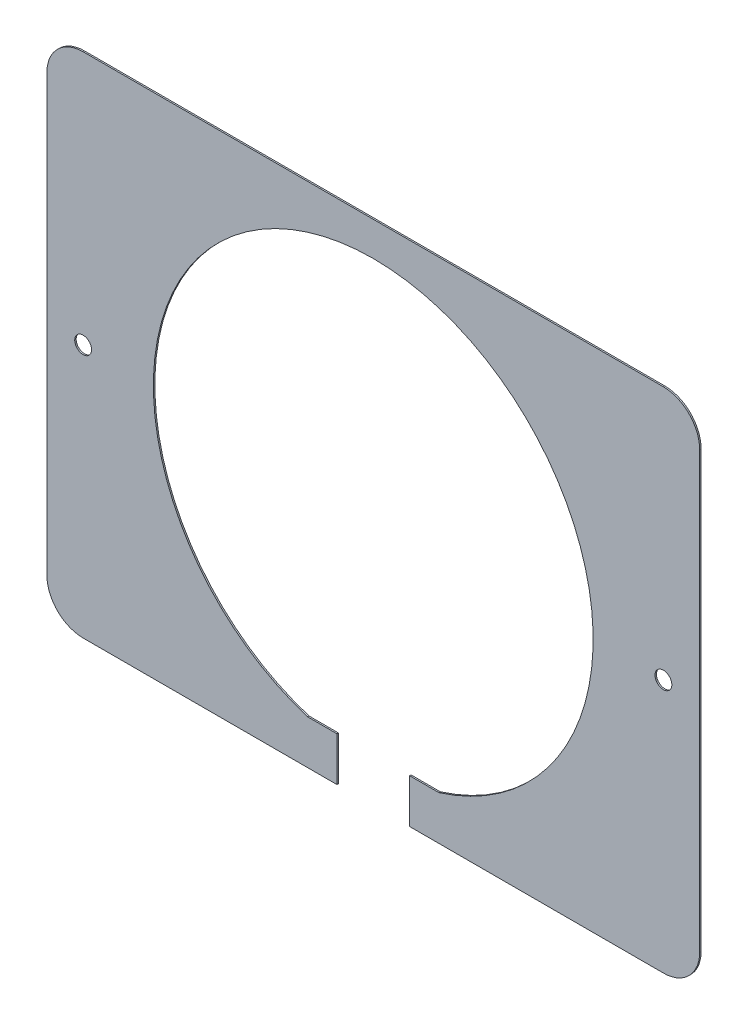
ISO-10303-21;
HEADER;
FILE_DESCRIPTION(('STEP AP214'),'2;1');
FILE_NAME('part.step','',(''),(''),'','','');
FILE_SCHEMA(('AUTOMOTIVE_DESIGN { 1 0 10303 214 1 1 1 1 }'));
ENDSEC;
DATA;
#1=APPLICATION_CONTEXT('core data for automotive mechanical design processes');
#2=APPLICATION_PROTOCOL_DEFINITION('international standard','automotive_design',2000,#1);
#3=PRODUCT_CONTEXT('',#1,'mechanical');
#4=PRODUCT('Part','Part','',(#3));
#5=PRODUCT_RELATED_PRODUCT_CATEGORY('part','',(#4));
#6=PRODUCT_DEFINITION_FORMATION('','',#4);
#7=PRODUCT_DEFINITION_CONTEXT('part definition',#1,'design');
#8=PRODUCT_DEFINITION('design','',#6,#7);
#9=PRODUCT_DEFINITION_SHAPE('','',#8);
#10=(LENGTH_UNIT() NAMED_UNIT(*) SI_UNIT(.MILLI.,.METRE.));
#11=(NAMED_UNIT(*) PLANE_ANGLE_UNIT() SI_UNIT($,.RADIAN.));
#12=(NAMED_UNIT(*) SI_UNIT($,.STERADIAN.) SOLID_ANGLE_UNIT());
#13=UNCERTAINTY_MEASURE_WITH_UNIT(LENGTH_MEASURE(1.E-05),#10,'distance_accuracy_value','');
#14=(GEOMETRIC_REPRESENTATION_CONTEXT(3) GLOBAL_UNCERTAINTY_ASSIGNED_CONTEXT((#13)) GLOBAL_UNIT_ASSIGNED_CONTEXT((#10,
#11,#12)) REPRESENTATION_CONTEXT('',''));
#15=CARTESIAN_POINT('',(0.,0.,0.));
#16=DIRECTION('',(0.,0.,1.));
#17=DIRECTION('',(1.,0.,0.));
#18=AXIS2_PLACEMENT_3D('',#15,#16,#17);
#19=CARTESIAN_POINT('',(0.,0.,0.254));
#20=DIRECTION('',(0.,0.,-1.));
#21=DIRECTION('',(-1.,0.,0.));
#22=AXIS2_PLACEMENT_3D('',#19,#20,#21);
#23=CYLINDRICAL_SURFACE('',#22,38.5);
#24=CARTESIAN_POINT('',(0.,0.,0.));
#25=DIRECTION('',(0.,0.,1.));
#26=DIRECTION('',(1.,0.,0.));
#27=AXIS2_PLACEMENT_3D('',#24,#25,#26);
#28=CIRCLE('',#27,38.5);
#29=CARTESIAN_POINT('',(11.5,-36.7423461417477,0.));
#30=VERTEX_POINT('',#29);
#31=CARTESIAN_POINT('',(-11.5,-36.7423461417477,0.));
#32=VERTEX_POINT('',#31);
#33=EDGE_CURVE('E149',#30,#32,#28,.T.);
#34=ORIENTED_EDGE('',*,*,#33,.F.);
#35=DIRECTION('',(0.,0.,-1.));
#36=VECTOR('',#35,1.);
#37=CARTESIAN_POINT('',(11.5,-36.7423461417477,0.254));
#38=LINE('',#37,#36);
#39=CARTESIAN_POINT('',(11.5,-36.7423461417477,0.254));
#40=VERTEX_POINT('',#39);
#41=EDGE_CURVE('E144',#40,#30,#38,.T.);
#42=ORIENTED_EDGE('',*,*,#41,.F.);
#43=CARTESIAN_POINT('',(0.,0.,0.254));
#44=DIRECTION('',(0.,0.,1.));
#45=DIRECTION('',(1.,0.,0.));
#46=AXIS2_PLACEMENT_3D('',#43,#44,#45);
#47=CIRCLE('',#46,38.5);
#48=CARTESIAN_POINT('',(-11.5,-36.7423461417477,0.254));
#49=VERTEX_POINT('',#48);
#50=EDGE_CURVE('E146',#40,#49,#47,.T.);
#51=ORIENTED_EDGE('',*,*,#50,.T.);
#52=DIRECTION('',(0.,0.,-1.));
#53=VECTOR('',#52,1.);
#54=CARTESIAN_POINT('',(-11.5,-36.7423461417477,0.254));
#55=LINE('',#54,#53);
#56=EDGE_CURVE('E189',#49,#32,#55,.T.);
#57=ORIENTED_EDGE('',*,*,#56,.T.);
#58=EDGE_LOOP('',(#34,#42,#51,#57));
#59=FACE_BOUND('',#58,.T.);
#60=ADVANCED_FACE('F42',(#59),#23,.F.);
#61=CARTESIAN_POINT('',(0.,-36.7423461417477,0.254));
#62=DIRECTION('',(0.,1.,0.));
#63=DIRECTION('',(0.,0.,1.));
#64=AXIS2_PLACEMENT_3D('',#61,#62,#63);
#65=PLANE('',#64);
#66=DIRECTION('',(1.,0.,0.));
#67=VECTOR('',#66,1.);
#68=CARTESIAN_POINT('',(0.,-36.7423461417477,0.));
#69=LINE('',#68,#67);
#70=CARTESIAN_POINT('',(6.35000000000001,-36.7423461417477,0.));
#71=VERTEX_POINT('',#70);
#72=EDGE_CURVE('E197',#71,#30,#69,.T.);
#73=ORIENTED_EDGE('',*,*,#72,.F.);
#74=DIRECTION('',(0.,0.,-1.));
#75=VECTOR('',#74,1.);
#76=CARTESIAN_POINT('',(6.35000000000001,-36.7423461417477,0.254));
#77=LINE('',#76,#75);
#78=CARTESIAN_POINT('',(6.35000000000001,-36.7423461417477,0.254));
#79=VERTEX_POINT('',#78);
#80=EDGE_CURVE('E155',#79,#71,#77,.T.);
#81=ORIENTED_EDGE('',*,*,#80,.F.);
#82=DIRECTION('',(1.,0.,0.));
#83=VECTOR('',#82,1.);
#84=CARTESIAN_POINT('',(0.,-36.7423461417477,0.254));
#85=LINE('',#84,#83);
#86=EDGE_CURVE('E161',#79,#40,#85,.T.);
#87=ORIENTED_EDGE('',*,*,#86,.T.);
#88=ORIENTED_EDGE('',*,*,#41,.T.);
#89=EDGE_LOOP('',(#73,#81,#87,#88));
#90=FACE_BOUND('',#89,.T.);
#91=ADVANCED_FACE('F167',(#90),#65,.T.);
#92=CARTESIAN_POINT('',(6.35000000000001,0.,0.254));
#93=DIRECTION('',(1.,0.,0.));
#94=DIRECTION('',(0.,0.,-1.));
#95=AXIS2_PLACEMENT_3D('',#92,#93,#94);
#96=PLANE('',#95);
#97=DIRECTION('',(0.,-1.,0.));
#98=VECTOR('',#97,1.);
#99=CARTESIAN_POINT('',(6.35000000000001,0.,0.));
#100=LINE('',#99,#98);
#101=CARTESIAN_POINT('',(6.35000000000001,-44.45,0.));
#102=VERTEX_POINT('',#101);
#103=EDGE_CURVE('E199',#71,#102,#100,.T.);
#104=ORIENTED_EDGE('',*,*,#103,.T.);
#105=DIRECTION('',(0.,0.,-1.));
#106=VECTOR('',#105,1.);
#107=CARTESIAN_POINT('',(6.35000000000001,-44.45,0.254));
#108=LINE('',#107,#106);
#109=CARTESIAN_POINT('',(6.35000000000001,-44.45,0.254));
#110=VERTEX_POINT('',#109);
#111=EDGE_CURVE('E228',#110,#102,#108,.T.);
#112=ORIENTED_EDGE('',*,*,#111,.F.);
#113=DIRECTION('',(0.,-1.,0.));
#114=VECTOR('',#113,1.);
#115=CARTESIAN_POINT('',(6.35000000000001,0.,0.254));
#116=LINE('',#115,#114);
#117=EDGE_CURVE('E169',#79,#110,#116,.T.);
#118=ORIENTED_EDGE('',*,*,#117,.F.);
#119=ORIENTED_EDGE('',*,*,#80,.T.);
#120=EDGE_LOOP('',(#104,#112,#118,#119));
#121=FACE_BOUND('',#120,.T.);
#122=ADVANCED_FACE('F302',(#121),#96,.F.);
#123=CARTESIAN_POINT('',(0.,-44.45,0.254));
#124=DIRECTION('',(0.,1.,0.));
#125=DIRECTION('',(0.,0.,1.));
#126=AXIS2_PLACEMENT_3D('',#123,#124,#125);
#127=PLANE('',#126);
#128=DIRECTION('',(1.,0.,0.));
#129=VECTOR('',#128,1.);
#130=CARTESIAN_POINT('',(0.,-44.45,0.));
#131=LINE('',#130,#129);
#132=CARTESIAN_POINT('',(50.8,-44.45,0.));
#133=VERTEX_POINT('',#132);
#134=EDGE_CURVE('E202',#102,#133,#131,.T.);
#135=ORIENTED_EDGE('',*,*,#134,.T.);
#136=DIRECTION('',(0.,0.,-1.));
#137=VECTOR('',#136,1.);
#138=CARTESIAN_POINT('',(50.8,-44.45,0.254));
#139=LINE('',#138,#137);
#140=CARTESIAN_POINT('',(50.8,-44.45,0.254));
#141=VERTEX_POINT('',#140);
#142=EDGE_CURVE('E259',#133,#141,#139,.F.);
#143=ORIENTED_EDGE('',*,*,#142,.T.);
#144=DIRECTION('',(1.,0.,0.));
#145=VECTOR('',#144,1.);
#146=CARTESIAN_POINT('',(0.,-44.45,0.254));
#147=LINE('',#146,#145);
#148=EDGE_CURVE('E171',#110,#141,#147,.T.);
#149=ORIENTED_EDGE('',*,*,#148,.F.);
#150=ORIENTED_EDGE('',*,*,#111,.T.);
#151=EDGE_LOOP('',(#135,#143,#149,#150));
#152=FACE_BOUND('',#151,.T.);
#153=ADVANCED_FACE('F262',(#152),#127,.F.);
#154=CARTESIAN_POINT('',(57.15,0.,0.254));
#155=DIRECTION('',(1.,0.,0.));
#156=DIRECTION('',(0.,1.,0.));
#157=AXIS2_PLACEMENT_3D('',#154,#155,#156);
#158=PLANE('',#157);
#159=DIRECTION('',(0.,-1.,0.));
#160=VECTOR('',#159,1.);
#161=CARTESIAN_POINT('',(57.15,0.,0.254));
#162=LINE('',#161,#160);
#163=CARTESIAN_POINT('',(57.15,38.1,0.254));
#164=VERTEX_POINT('',#163);
#165=CARTESIAN_POINT('',(57.15,-38.1,0.254));
#166=VERTEX_POINT('',#165);
#167=EDGE_CURVE('E177',#164,#166,#162,.T.);
#168=ORIENTED_EDGE('',*,*,#167,.T.);
#169=DIRECTION('',(0.,0.,-1.));
#170=VECTOR('',#169,1.);
#171=CARTESIAN_POINT('',(57.15,-38.1,0.));
#172=LINE('',#171,#170);
#173=CARTESIAN_POINT('',(57.15,-38.1,0.));
#174=VERTEX_POINT('',#173);
#175=EDGE_CURVE('E256',#166,#174,#172,.T.);
#176=ORIENTED_EDGE('',*,*,#175,.T.);
#177=DIRECTION('',(0.,-1.,0.));
#178=VECTOR('',#177,1.);
#179=CARTESIAN_POINT('',(57.15,0.,0.));
#180=LINE('',#179,#178);
#181=CARTESIAN_POINT('',(57.15,38.1,0.));
#182=VERTEX_POINT('',#181);
#183=EDGE_CURVE('E205',#182,#174,#180,.T.);
#184=ORIENTED_EDGE('',*,*,#183,.F.);
#185=DIRECTION('',(0.,0.,-1.));
#186=VECTOR('',#185,1.);
#187=CARTESIAN_POINT('',(57.15,38.1,0.254));
#188=LINE('',#187,#186);
#189=EDGE_CURVE('E254',#182,#164,#188,.F.);
#190=ORIENTED_EDGE('',*,*,#189,.T.);
#191=EDGE_LOOP('',(#168,#176,#184,#190));
#192=FACE_BOUND('',#191,.T.);
#193=ADVANCED_FACE('F270',(#192),#158,.T.);
#194=CARTESIAN_POINT('',(0.,44.45,0.254));
#195=DIRECTION('',(0.,1.,0.));
#196=DIRECTION('',(0.,0.,1.));
#197=AXIS2_PLACEMENT_3D('',#194,#195,#196);
#198=PLANE('',#197);
#199=DIRECTION('',(1.,0.,0.));
#200=VECTOR('',#199,1.);
#201=CARTESIAN_POINT('',(0.,44.45,0.254));
#202=LINE('',#201,#200);
#203=CARTESIAN_POINT('',(-50.8,44.45,0.254));
#204=VERTEX_POINT('',#203);
#205=CARTESIAN_POINT('',(50.8,44.45,0.254));
#206=VERTEX_POINT('',#205);
#207=EDGE_CURVE('E181',#204,#206,#202,.T.);
#208=ORIENTED_EDGE('',*,*,#207,.T.);
#209=DIRECTION('',(0.,0.,-1.));
#210=VECTOR('',#209,1.);
#211=CARTESIAN_POINT('',(50.8,44.45,0.254));
#212=LINE('',#211,#210);
#213=CARTESIAN_POINT('',(50.8,44.45,0.));
#214=VERTEX_POINT('',#213);
#215=EDGE_CURVE('E11',#206,#214,#212,.T.);
#216=ORIENTED_EDGE('',*,*,#215,.T.);
#217=DIRECTION('',(1.,0.,0.));
#218=VECTOR('',#217,1.);
#219=CARTESIAN_POINT('',(0.,44.45,0.));
#220=LINE('',#219,#218);
#221=CARTESIAN_POINT('',(-50.8,44.45,0.));
#222=VERTEX_POINT('',#221);
#223=EDGE_CURVE('E209',#222,#214,#220,.T.);
#224=ORIENTED_EDGE('',*,*,#223,.F.);
#225=DIRECTION('',(0.,0.,-1.));
#226=VECTOR('',#225,1.);
#227=CARTESIAN_POINT('',(-50.8,44.45,0.254));
#228=LINE('',#227,#226);
#229=EDGE_CURVE('E50',#222,#204,#228,.F.);
#230=ORIENTED_EDGE('',*,*,#229,.T.);
#231=EDGE_LOOP('',(#208,#216,#224,#230));
#232=FACE_BOUND('',#231,.T.);
#233=ADVANCED_FACE('F278',(#232),#198,.T.);
#234=CARTESIAN_POINT('',(-57.15,0.,0.254));
#235=DIRECTION('',(1.,0.,0.));
#236=DIRECTION('',(0.,1.,0.));
#237=AXIS2_PLACEMENT_3D('',#234,#235,#236);
#238=PLANE('',#237);
#239=DIRECTION('',(0.,-1.,0.));
#240=VECTOR('',#239,1.);
#241=CARTESIAN_POINT('',(-57.15,0.,0.));
#242=LINE('',#241,#240);
#243=CARTESIAN_POINT('',(-57.15,38.1,0.));
#244=VERTEX_POINT('',#243);
#245=CARTESIAN_POINT('',(-57.15,-38.1,0.));
#246=VERTEX_POINT('',#245);
#247=EDGE_CURVE('E212',#244,#246,#242,.T.);
#248=ORIENTED_EDGE('',*,*,#247,.T.);
#249=DIRECTION('',(0.,0.,-1.));
#250=VECTOR('',#249,1.);
#251=CARTESIAN_POINT('',(-57.15,-38.1,0.254));
#252=LINE('',#251,#250);
#253=CARTESIAN_POINT('',(-57.15,-38.1,0.254));
#254=VERTEX_POINT('',#253);
#255=EDGE_CURVE('E245',#246,#254,#252,.F.);
#256=ORIENTED_EDGE('',*,*,#255,.T.);
#257=DIRECTION('',(0.,-1.,0.));
#258=VECTOR('',#257,1.);
#259=CARTESIAN_POINT('',(-57.15,0.,0.254));
#260=LINE('',#259,#258);
#261=CARTESIAN_POINT('',(-57.15,38.1,0.254));
#262=VERTEX_POINT('',#261);
#263=EDGE_CURVE('E183',#262,#254,#260,.T.);
#264=ORIENTED_EDGE('',*,*,#263,.F.);
#265=DIRECTION('',(0.,0.,-1.));
#266=VECTOR('',#265,1.);
#267=CARTESIAN_POINT('',(-57.15,38.1,0.));
#268=LINE('',#267,#266);
#269=EDGE_CURVE('E242',#262,#244,#268,.T.);
#270=ORIENTED_EDGE('',*,*,#269,.T.);
#271=EDGE_LOOP('',(#248,#256,#264,#270));
#272=FACE_BOUND('',#271,.T.);
#273=ADVANCED_FACE('F285',(#272),#238,.F.);
#274=CARTESIAN_POINT('',(-50.8,-44.45,0.254));
#275=VERTEX_POINT('',#274);
#276=CARTESIAN_POINT('',(-6.34999999999999,-44.45,0.254));
#277=VERTEX_POINT('',#276);
#278=EDGE_CURVE('E178',#275,#277,#147,.T.);
#279=ORIENTED_EDGE('',*,*,#278,.F.);
#280=DIRECTION('',(0.,0.,-1.));
#281=VECTOR('',#280,1.);
#282=CARTESIAN_POINT('',(-50.8,-44.45,0.254));
#283=LINE('',#282,#281);
#284=CARTESIAN_POINT('',(-50.8,-44.45,0.));
#285=VERTEX_POINT('',#284);
#286=EDGE_CURVE('E154',#275,#285,#283,.T.);
#287=ORIENTED_EDGE('',*,*,#286,.T.);
#288=CARTESIAN_POINT('',(-6.34999999999999,-44.45,0.));
#289=VERTEX_POINT('',#288);
#290=EDGE_CURVE('E206',#285,#289,#131,.T.);
#291=ORIENTED_EDGE('',*,*,#290,.T.);
#292=DIRECTION('',(0.,0.,-1.));
#293=VECTOR('',#292,1.);
#294=CARTESIAN_POINT('',(-6.34999999999999,-44.45,0.254));
#295=LINE('',#294,#293);
#296=EDGE_CURVE('E225',#277,#289,#295,.T.);
#297=ORIENTED_EDGE('',*,*,#296,.F.);
#298=EDGE_LOOP('',(#279,#287,#291,#297));
#299=FACE_BOUND('',#298,.T.);
#300=ADVANCED_FACE('F293',(#299),#127,.F.);
#301=CARTESIAN_POINT('',(-6.34999999999999,0.,0.254));
#302=DIRECTION('',(1.,0.,0.));
#303=DIRECTION('',(0.,1.,0.));
#304=AXIS2_PLACEMENT_3D('',#301,#302,#303);
#305=PLANE('',#304);
#306=DIRECTION('',(0.,-1.,0.));
#307=VECTOR('',#306,1.);
#308=CARTESIAN_POINT('',(-6.34999999999999,0.,0.));
#309=LINE('',#308,#307);
#310=CARTESIAN_POINT('',(-6.34999999999999,-36.7423461417477,0.));
#311=VERTEX_POINT('',#310);
#312=EDGE_CURVE('E215',#311,#289,#309,.T.);
#313=ORIENTED_EDGE('',*,*,#312,.F.);
#314=DIRECTION('',(0.,0.,-1.));
#315=VECTOR('',#314,1.);
#316=CARTESIAN_POINT('',(-6.34999999999999,-36.7423461417477,0.254));
#317=LINE('',#316,#315);
#318=CARTESIAN_POINT('',(-6.34999999999999,-36.7423461417477,0.254));
#319=VERTEX_POINT('',#318);
#320=EDGE_CURVE('E223',#319,#311,#317,.T.);
#321=ORIENTED_EDGE('',*,*,#320,.F.);
#322=DIRECTION('',(0.,-1.,0.));
#323=VECTOR('',#322,1.);
#324=CARTESIAN_POINT('',(-6.34999999999999,0.,0.254));
#325=LINE('',#324,#323);
#326=EDGE_CURVE('E185',#319,#277,#325,.T.);
#327=ORIENTED_EDGE('',*,*,#326,.T.);
#328=ORIENTED_EDGE('',*,*,#296,.T.);
#329=EDGE_LOOP('',(#313,#321,#327,#328));
#330=FACE_BOUND('',#329,.T.);
#331=ADVANCED_FACE('F321',(#330),#305,.T.);
#332=CARTESIAN_POINT('',(-50.8,0.,0.254));
#333=DIRECTION('',(0.,0.,-1.));
#334=DIRECTION('',(-1.,0.,0.));
#335=AXIS2_PLACEMENT_3D('',#332,#333,#334);
#336=CYLINDRICAL_SURFACE('',#335,1.475);
#337=CARTESIAN_POINT('',(-50.8,0.,0.254));
#338=DIRECTION('',(0.,0.,1.));
#339=DIRECTION('',(1.,0.,0.));
#340=AXIS2_PLACEMENT_3D('',#337,#338,#339);
#341=CIRCLE('',#340,1.475);
#342=CARTESIAN_POINT('',(-49.325,0.,0.254));
#343=VERTEX_POINT('',#342);
#344=EDGE_CURVE('E165',#343,#343,#341,.T.);
#345=ORIENTED_EDGE('',*,*,#344,.T.);
#346=EDGE_LOOP('',(#345));
#347=FACE_BOUND('',#346,.T.);
#348=CARTESIAN_POINT('',(-50.8,0.,0.));
#349=DIRECTION('',(0.,0.,1.));
#350=DIRECTION('',(1.,0.,0.));
#351=AXIS2_PLACEMENT_3D('',#348,#349,#350);
#352=CIRCLE('',#351,1.475);
#353=CARTESIAN_POINT('',(-49.325,0.,0.));
#354=VERTEX_POINT('',#353);
#355=EDGE_CURVE('E193',#354,#354,#352,.T.);
#356=ORIENTED_EDGE('',*,*,#355,.F.);
#357=EDGE_LOOP('',(#356));
#358=FACE_BOUND('',#357,.T.);
#359=ADVANCED_FACE('F317',(#347,#358),#336,.F.);
#360=CARTESIAN_POINT('',(50.8,0.,0.254));
#361=DIRECTION('',(0.,0.,-1.));
#362=DIRECTION('',(-1.,0.,0.));
#363=AXIS2_PLACEMENT_3D('',#360,#361,#362);
#364=CYLINDRICAL_SURFACE('',#363,1.475);
#365=CARTESIAN_POINT('',(50.8,0.,0.254));
#366=DIRECTION('',(0.,0.,1.));
#367=DIRECTION('',(1.,0.,0.));
#368=AXIS2_PLACEMENT_3D('',#365,#366,#367);
#369=CIRCLE('',#368,1.475);
#370=CARTESIAN_POINT('',(52.275,0.,0.254));
#371=VERTEX_POINT('',#370);
#372=EDGE_CURVE('E221',#371,#371,#369,.T.);
#373=ORIENTED_EDGE('',*,*,#372,.T.);
#374=EDGE_LOOP('',(#373));
#375=FACE_BOUND('',#374,.T.);
#376=CARTESIAN_POINT('',(50.8,0.,0.));
#377=DIRECTION('',(0.,0.,1.));
#378=DIRECTION('',(1.,0.,0.));
#379=AXIS2_PLACEMENT_3D('',#376,#377,#378);
#380=CIRCLE('',#379,1.475);
#381=CARTESIAN_POINT('',(52.275,0.,0.));
#382=VERTEX_POINT('',#381);
#383=EDGE_CURVE('E190',#382,#382,#380,.T.);
#384=ORIENTED_EDGE('',*,*,#383,.F.);
#385=EDGE_LOOP('',(#384));
#386=FACE_BOUND('',#385,.T.);
#387=ADVANCED_FACE('F320',(#375,#386),#364,.F.);
#388=CARTESIAN_POINT('',(0.,-36.7423461417477,0.254));
#389=DIRECTION('',(0.,1.,0.));
#390=DIRECTION('',(0.,0.,1.));
#391=AXIS2_PLACEMENT_3D('',#388,#389,#390);
#392=PLANE('',#391);
#393=DIRECTION('',(1.,0.,0.));
#394=VECTOR('',#393,1.);
#395=CARTESIAN_POINT('',(0.,-36.7423461417477,0.));
#396=LINE('',#395,#394);
#397=EDGE_CURVE('E218',#32,#311,#396,.T.);
#398=ORIENTED_EDGE('',*,*,#397,.F.);
#399=ORIENTED_EDGE('',*,*,#56,.F.);
#400=DIRECTION('',(1.,0.,0.));
#401=VECTOR('',#400,1.);
#402=CARTESIAN_POINT('',(0.,-36.7423461417477,0.254));
#403=LINE('',#402,#401);
#404=EDGE_CURVE('E164',#49,#319,#403,.T.);
#405=ORIENTED_EDGE('',*,*,#404,.T.);
#406=ORIENTED_EDGE('',*,*,#320,.T.);
#407=EDGE_LOOP('',(#398,#399,#405,#406));
#408=FACE_BOUND('',#407,.T.);
#409=ADVANCED_FACE('F298',(#408),#392,.T.);
#410=CARTESIAN_POINT('',(0.,0.,0.254));
#411=DIRECTION('',(0.,0.,1.));
#412=DIRECTION('',(1.,0.,0.));
#413=AXIS2_PLACEMENT_3D('',#410,#411,#412);
#414=PLANE('',#413);
#415=ORIENTED_EDGE('',*,*,#372,.F.);
#416=EDGE_LOOP('',(#415));
#417=FACE_BOUND('',#416,.T.);
#418=ORIENTED_EDGE('',*,*,#344,.F.);
#419=EDGE_LOOP('',(#418));
#420=FACE_BOUND('',#419,.T.);
#421=ORIENTED_EDGE('',*,*,#263,.T.);
#422=CARTESIAN_POINT('',(-50.8,-38.1,0.254));
#423=DIRECTION('',(0.,0.,1.));
#424=DIRECTION('',(1.,0.,0.));
#425=AXIS2_PLACEMENT_3D('',#422,#423,#424);
#426=CIRCLE('',#425,6.35);
#427=EDGE_CURVE('E252',#254,#275,#426,.T.);
#428=ORIENTED_EDGE('',*,*,#427,.T.);
#429=ORIENTED_EDGE('',*,*,#278,.T.);
#430=ORIENTED_EDGE('',*,*,#326,.F.);
#431=ORIENTED_EDGE('',*,*,#404,.F.);
#432=ORIENTED_EDGE('',*,*,#50,.F.);
#433=ORIENTED_EDGE('',*,*,#86,.F.);
#434=ORIENTED_EDGE('',*,*,#117,.T.);
#435=ORIENTED_EDGE('',*,*,#148,.T.);
#436=CARTESIAN_POINT('',(50.8,-38.1,0.254));
#437=DIRECTION('',(0.,0.,1.));
#438=DIRECTION('',(1.,0.,0.));
#439=AXIS2_PLACEMENT_3D('',#436,#437,#438);
#440=CIRCLE('',#439,6.35);
#441=EDGE_CURVE('E250',#141,#166,#440,.T.);
#442=ORIENTED_EDGE('',*,*,#441,.T.);
#443=ORIENTED_EDGE('',*,*,#167,.F.);
#444=CARTESIAN_POINT('',(50.8,38.1,0.254));
#445=DIRECTION('',(0.,0.,1.));
#446=DIRECTION('',(1.,0.,0.));
#447=AXIS2_PLACEMENT_3D('',#444,#445,#446);
#448=CIRCLE('',#447,6.35);
#449=EDGE_CURVE('E57',#164,#206,#448,.T.);
#450=ORIENTED_EDGE('',*,*,#449,.T.);
#451=ORIENTED_EDGE('',*,*,#207,.F.);
#452=CARTESIAN_POINT('',(-50.8,38.1,0.254));
#453=DIRECTION('',(0.,0.,1.));
#454=DIRECTION('',(1.,0.,0.));
#455=AXIS2_PLACEMENT_3D('',#452,#453,#454);
#456=CIRCLE('',#455,6.35);
#457=EDGE_CURVE('E247',#204,#262,#456,.T.);
#458=ORIENTED_EDGE('',*,*,#457,.T.);
#459=EDGE_LOOP('',(#421,#428,#429,#430,#431,#432,#433,#434,#435,#442,#443,#450,#451,#458));
#460=FACE_BOUND('',#459,.T.);
#461=ADVANCED_FACE('F159',(#417,#420,#460),#414,.T.);
#462=CARTESIAN_POINT('',(0.,0.,0.));
#463=DIRECTION('',(0.,0.,1.));
#464=DIRECTION('',(1.,0.,0.));
#465=AXIS2_PLACEMENT_3D('',#462,#463,#464);
#466=PLANE('',#465);
#467=ORIENTED_EDGE('',*,*,#383,.T.);
#468=EDGE_LOOP('',(#467));
#469=FACE_BOUND('',#468,.T.);
#470=ORIENTED_EDGE('',*,*,#355,.T.);
#471=EDGE_LOOP('',(#470));
#472=FACE_BOUND('',#471,.T.);
#473=ORIENTED_EDGE('',*,*,#290,.F.);
#474=CARTESIAN_POINT('',(-50.8,-38.1,0.));
#475=DIRECTION('',(0.,0.,1.));
#476=DIRECTION('',(1.,0.,0.));
#477=AXIS2_PLACEMENT_3D('',#474,#475,#476);
#478=CIRCLE('',#477,6.35);
#479=EDGE_CURVE('E240',#285,#246,#478,.F.);
#480=ORIENTED_EDGE('',*,*,#479,.T.);
#481=ORIENTED_EDGE('',*,*,#247,.F.);
#482=CARTESIAN_POINT('',(-50.8,38.1,0.));
#483=DIRECTION('',(0.,0.,1.));
#484=DIRECTION('',(1.,0.,0.));
#485=AXIS2_PLACEMENT_3D('',#482,#483,#484);
#486=CIRCLE('',#485,6.35);
#487=EDGE_CURVE('E234',#244,#222,#486,.F.);
#488=ORIENTED_EDGE('',*,*,#487,.T.);
#489=ORIENTED_EDGE('',*,*,#223,.T.);
#490=CARTESIAN_POINT('',(50.8,38.1,0.));
#491=DIRECTION('',(0.,0.,1.));
#492=DIRECTION('',(1.,0.,0.));
#493=AXIS2_PLACEMENT_3D('',#490,#491,#492);
#494=CIRCLE('',#493,6.35);
#495=EDGE_CURVE('E236',#214,#182,#494,.F.);
#496=ORIENTED_EDGE('',*,*,#495,.T.);
#497=ORIENTED_EDGE('',*,*,#183,.T.);
#498=CARTESIAN_POINT('',(50.8,-38.1,0.));
#499=DIRECTION('',(0.,0.,1.));
#500=DIRECTION('',(1.,0.,0.));
#501=AXIS2_PLACEMENT_3D('',#498,#499,#500);
#502=CIRCLE('',#501,6.35);
#503=EDGE_CURVE('E238',#174,#133,#502,.F.);
#504=ORIENTED_EDGE('',*,*,#503,.T.);
#505=ORIENTED_EDGE('',*,*,#134,.F.);
#506=ORIENTED_EDGE('',*,*,#103,.F.);
#507=ORIENTED_EDGE('',*,*,#72,.T.);
#508=ORIENTED_EDGE('',*,*,#33,.T.);
#509=ORIENTED_EDGE('',*,*,#397,.T.);
#510=ORIENTED_EDGE('',*,*,#312,.T.);
#511=EDGE_LOOP('',(#473,#480,#481,#488,#489,#496,#497,#504,#505,#506,#507,#508,#509,#510));
#512=FACE_BOUND('',#511,.T.);
#513=ADVANCED_FACE('F274',(#469,#472,#512),#466,.F.);
#514=CARTESIAN_POINT('',(-50.8,-38.1,0.254));
#515=DIRECTION('',(0.,0.,-1.));
#516=DIRECTION('',(-1.,0.,0.));
#517=AXIS2_PLACEMENT_3D('',#514,#515,#516);
#518=CYLINDRICAL_SURFACE('',#517,6.35);
#519=ORIENTED_EDGE('',*,*,#427,.F.);
#520=ORIENTED_EDGE('',*,*,#255,.F.);
#521=ORIENTED_EDGE('',*,*,#479,.F.);
#522=ORIENTED_EDGE('',*,*,#286,.F.);
#523=EDGE_LOOP('',(#519,#520,#521,#522));
#524=FACE_BOUND('',#523,.T.);
#525=ADVANCED_FACE('F290',(#524),#518,.T.);
#526=CARTESIAN_POINT('',(50.8,-38.1,0.254));
#527=DIRECTION('',(0.,0.,1.));
#528=DIRECTION('',(1.,0.,0.));
#529=AXIS2_PLACEMENT_3D('',#526,#527,#528);
#530=CYLINDRICAL_SURFACE('',#529,6.35);
#531=ORIENTED_EDGE('',*,*,#441,.F.);
#532=ORIENTED_EDGE('',*,*,#142,.F.);
#533=ORIENTED_EDGE('',*,*,#503,.F.);
#534=ORIENTED_EDGE('',*,*,#175,.F.);
#535=EDGE_LOOP('',(#531,#532,#533,#534));
#536=FACE_BOUND('',#535,.T.);
#537=ADVANCED_FACE('F267',(#536),#530,.T.);
#538=CARTESIAN_POINT('',(50.8,38.1,0.254));
#539=DIRECTION('',(0.,0.,-1.));
#540=DIRECTION('',(-1.,0.,0.));
#541=AXIS2_PLACEMENT_3D('',#538,#539,#540);
#542=CYLINDRICAL_SURFACE('',#541,6.35);
#543=ORIENTED_EDGE('',*,*,#449,.F.);
#544=ORIENTED_EDGE('',*,*,#189,.F.);
#545=ORIENTED_EDGE('',*,*,#495,.F.);
#546=ORIENTED_EDGE('',*,*,#215,.F.);
#547=EDGE_LOOP('',(#543,#544,#545,#546));
#548=FACE_BOUND('',#547,.T.);
#549=ADVANCED_FACE('F277',(#548),#542,.T.);
#550=CARTESIAN_POINT('',(-50.8,38.1,0.254));
#551=DIRECTION('',(0.,0.,1.));
#552=DIRECTION('',(1.,0.,0.));
#553=AXIS2_PLACEMENT_3D('',#550,#551,#552);
#554=CYLINDRICAL_SURFACE('',#553,6.35);
#555=ORIENTED_EDGE('',*,*,#457,.F.);
#556=ORIENTED_EDGE('',*,*,#229,.F.);
#557=ORIENTED_EDGE('',*,*,#487,.F.);
#558=ORIENTED_EDGE('',*,*,#269,.F.);
#559=EDGE_LOOP('',(#555,#556,#557,#558));
#560=FACE_BOUND('',#559,.T.);
#561=ADVANCED_FACE('F44',(#560),#554,.T.);
#562=CLOSED_SHELL('',(#60,#91,#122,#153,#193,#233,#273,#300,#331,#359,#387,#409,#461,#513,#525,
#537,#549,#561));
#563=MANIFOLD_SOLID_BREP('B2',#562);
#564=ADVANCED_BREP_SHAPE_REPRESENTATION('',(#18,#563),#14);
#565=SHAPE_DEFINITION_REPRESENTATION(#9,#564);
ENDSEC;
END-ISO-10303-21;
